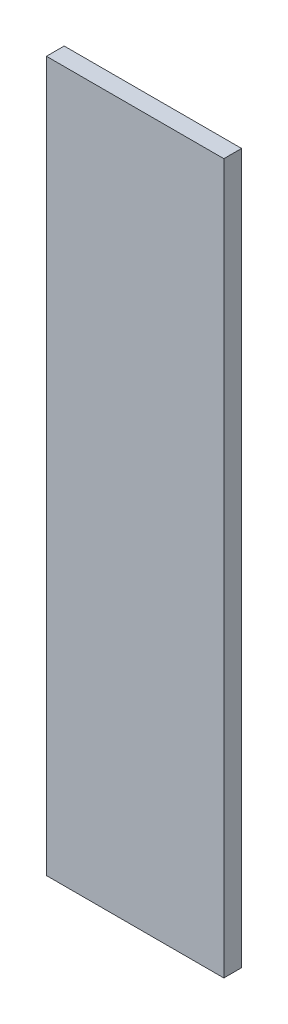
ISO-10303-21;
HEADER;
FILE_DESCRIPTION(('STEP AP214'),'2;1');
FILE_NAME('part.step','',(''),(''),'','','');
FILE_SCHEMA(('AUTOMOTIVE_DESIGN { 1 0 10303 214 1 1 1 1 }'));
ENDSEC;
DATA;
#1=APPLICATION_CONTEXT('core data for automotive mechanical design processes');
#2=APPLICATION_PROTOCOL_DEFINITION('international standard','automotive_design',2000,#1);
#3=PRODUCT_CONTEXT('',#1,'mechanical');
#4=PRODUCT('Part','Part','',(#3));
#5=PRODUCT_RELATED_PRODUCT_CATEGORY('part','',(#4));
#6=PRODUCT_DEFINITION_FORMATION('','',#4);
#7=PRODUCT_DEFINITION_CONTEXT('part definition',#1,'design');
#8=PRODUCT_DEFINITION('design','',#6,#7);
#9=PRODUCT_DEFINITION_SHAPE('','',#8);
#10=(LENGTH_UNIT() NAMED_UNIT(*) SI_UNIT(.MILLI.,.METRE.));
#11=(NAMED_UNIT(*) PLANE_ANGLE_UNIT() SI_UNIT($,.RADIAN.));
#12=(NAMED_UNIT(*) SI_UNIT($,.STERADIAN.) SOLID_ANGLE_UNIT());
#13=UNCERTAINTY_MEASURE_WITH_UNIT(LENGTH_MEASURE(1.E-05),#10,'distance_accuracy_value','');
#14=(GEOMETRIC_REPRESENTATION_CONTEXT(3) GLOBAL_UNCERTAINTY_ASSIGNED_CONTEXT((#13)) GLOBAL_UNIT_ASSIGNED_CONTEXT((#10,
#11,#12)) REPRESENTATION_CONTEXT('',''));
#15=CARTESIAN_POINT('',(0.,0.,0.));
#16=DIRECTION('',(0.,0.,1.));
#17=DIRECTION('',(1.,0.,0.));
#18=AXIS2_PLACEMENT_3D('',#15,#16,#17);
#19=CARTESIAN_POINT('',(0.,0.,8.));
#20=DIRECTION('',(1.,0.,0.));
#21=DIRECTION('',(0.,1.,0.));
#22=AXIS2_PLACEMENT_3D('',#19,#20,#21);
#23=PLANE('',#22);
#24=DIRECTION('',(0.,-1.,0.));
#25=VECTOR('',#24,1.);
#26=CARTESIAN_POINT('',(0.,0.,0.));
#27=LINE('',#26,#25);
#28=CARTESIAN_POINT('',(0.,320.,0.));
#29=VERTEX_POINT('',#28);
#30=CARTESIAN_POINT('',(0.,0.,0.));
#31=VERTEX_POINT('',#30);
#32=EDGE_CURVE('E93',#29,#31,#27,.T.);
#33=ORIENTED_EDGE('',*,*,#32,.T.);
#34=DIRECTION('',(0.,0.,-1.));
#35=VECTOR('',#34,1.);
#36=CARTESIAN_POINT('',(0.,0.,8.));
#37=LINE('',#36,#35);
#38=CARTESIAN_POINT('',(0.,0.,8.));
#39=VERTEX_POINT('',#38);
#40=EDGE_CURVE('E11',#39,#31,#37,.T.);
#41=ORIENTED_EDGE('',*,*,#40,.F.);
#42=DIRECTION('',(0.,-1.,0.));
#43=VECTOR('',#42,1.);
#44=CARTESIAN_POINT('',(0.,0.,8.));
#45=LINE('',#44,#43);
#46=CARTESIAN_POINT('',(0.,320.,8.));
#47=VERTEX_POINT('',#46);
#48=EDGE_CURVE('E81',#47,#39,#45,.T.);
#49=ORIENTED_EDGE('',*,*,#48,.F.);
#50=DIRECTION('',(0.,0.,-1.));
#51=VECTOR('',#50,1.);
#52=CARTESIAN_POINT('',(0.,320.,8.));
#53=LINE('',#52,#51);
#54=EDGE_CURVE('E89',#47,#29,#53,.T.);
#55=ORIENTED_EDGE('',*,*,#54,.T.);
#56=EDGE_LOOP('',(#33,#41,#49,#55));
#57=FACE_BOUND('',#56,.T.);
#58=ADVANCED_FACE('F30',(#57),#23,.F.);
#59=CARTESIAN_POINT('',(0.,0.,8.));
#60=DIRECTION('',(0.,1.,0.));
#61=DIRECTION('',(-1.,0.,0.));
#62=AXIS2_PLACEMENT_3D('',#59,#60,#61);
#63=PLANE('',#62);
#64=DIRECTION('',(1.,0.,0.));
#65=VECTOR('',#64,1.);
#66=CARTESIAN_POINT('',(0.,0.,0.));
#67=LINE('',#66,#65);
#68=CARTESIAN_POINT('',(80.,0.,0.));
#69=VERTEX_POINT('',#68);
#70=EDGE_CURVE('E85',#31,#69,#67,.T.);
#71=ORIENTED_EDGE('',*,*,#70,.T.);
#72=DIRECTION('',(0.,0.,-1.));
#73=VECTOR('',#72,1.);
#74=CARTESIAN_POINT('',(80.,0.,8.));
#75=LINE('',#74,#73);
#76=CARTESIAN_POINT('',(80.,0.,8.));
#77=VERTEX_POINT('',#76);
#78=EDGE_CURVE('E38',#77,#69,#75,.T.);
#79=ORIENTED_EDGE('',*,*,#78,.F.);
#80=DIRECTION('',(1.,0.,0.));
#81=VECTOR('',#80,1.);
#82=CARTESIAN_POINT('',(0.,0.,8.));
#83=LINE('',#82,#81);
#84=EDGE_CURVE('E76',#39,#77,#83,.T.);
#85=ORIENTED_EDGE('',*,*,#84,.F.);
#86=ORIENTED_EDGE('',*,*,#40,.T.);
#87=EDGE_LOOP('',(#71,#79,#85,#86));
#88=FACE_BOUND('',#87,.T.);
#89=ADVANCED_FACE('F84',(#88),#63,.F.);
#90=CARTESIAN_POINT('',(80.,0.,8.));
#91=DIRECTION('',(-1.,0.,0.));
#92=DIRECTION('',(0.,0.,1.));
#93=AXIS2_PLACEMENT_3D('',#90,#91,#92);
#94=PLANE('',#93);
#95=DIRECTION('',(0.,1.,0.));
#96=VECTOR('',#95,1.);
#97=CARTESIAN_POINT('',(80.,0.,0.));
#98=LINE('',#97,#96);
#99=CARTESIAN_POINT('',(80.,320.,0.));
#100=VERTEX_POINT('',#99);
#101=EDGE_CURVE('E63',#69,#100,#98,.T.);
#102=ORIENTED_EDGE('',*,*,#101,.T.);
#103=DIRECTION('',(0.,0.,-1.));
#104=VECTOR('',#103,1.);
#105=CARTESIAN_POINT('',(80.,320.,8.));
#106=LINE('',#105,#104);
#107=CARTESIAN_POINT('',(80.,320.,8.));
#108=VERTEX_POINT('',#107);
#109=EDGE_CURVE('E86',#108,#100,#106,.T.);
#110=ORIENTED_EDGE('',*,*,#109,.F.);
#111=DIRECTION('',(0.,1.,0.));
#112=VECTOR('',#111,1.);
#113=CARTESIAN_POINT('',(80.,0.,8.));
#114=LINE('',#113,#112);
#115=EDGE_CURVE('E79',#77,#108,#114,.T.);
#116=ORIENTED_EDGE('',*,*,#115,.F.);
#117=ORIENTED_EDGE('',*,*,#78,.T.);
#118=EDGE_LOOP('',(#102,#110,#116,#117));
#119=FACE_BOUND('',#118,.T.);
#120=ADVANCED_FACE('F87',(#119),#94,.F.);
#121=CARTESIAN_POINT('',(0.,320.,8.));
#122=DIRECTION('',(0.,-1.,0.));
#123=DIRECTION('',(0.,0.,-1.));
#124=AXIS2_PLACEMENT_3D('',#121,#122,#123);
#125=PLANE('',#124);
#126=DIRECTION('',(-1.,0.,0.));
#127=VECTOR('',#126,1.);
#128=CARTESIAN_POINT('',(0.,320.,0.));
#129=LINE('',#128,#127);
#130=EDGE_CURVE('E69',#100,#29,#129,.T.);
#131=ORIENTED_EDGE('',*,*,#130,.T.);
#132=ORIENTED_EDGE('',*,*,#54,.F.);
#133=DIRECTION('',(-1.,0.,0.));
#134=VECTOR('',#133,1.);
#135=CARTESIAN_POINT('',(0.,320.,8.));
#136=LINE('',#135,#134);
#137=EDGE_CURVE('E46',#108,#47,#136,.T.);
#138=ORIENTED_EDGE('',*,*,#137,.F.);
#139=ORIENTED_EDGE('',*,*,#109,.T.);
#140=EDGE_LOOP('',(#131,#132,#138,#139));
#141=FACE_BOUND('',#140,.T.);
#142=ADVANCED_FACE('F100',(#141),#125,.F.);
#143=CARTESIAN_POINT('',(0.,0.,8.));
#144=DIRECTION('',(0.,0.,-1.));
#145=DIRECTION('',(-1.,0.,0.));
#146=AXIS2_PLACEMENT_3D('',#143,#144,#145);
#147=PLANE('',#146);
#148=ORIENTED_EDGE('',*,*,#48,.T.);
#149=ORIENTED_EDGE('',*,*,#84,.T.);
#150=ORIENTED_EDGE('',*,*,#115,.T.);
#151=ORIENTED_EDGE('',*,*,#137,.T.);
#152=EDGE_LOOP('',(#148,#149,#150,#151));
#153=FACE_BOUND('',#152,.T.);
#154=ADVANCED_FACE('F77',(#153),#147,.F.);
#155=CARTESIAN_POINT('',(0.,0.,0.));
#156=DIRECTION('',(0.,0.,-1.));
#157=DIRECTION('',(-1.,0.,0.));
#158=AXIS2_PLACEMENT_3D('',#155,#156,#157);
#159=PLANE('',#158);
#160=ORIENTED_EDGE('',*,*,#32,.F.);
#161=ORIENTED_EDGE('',*,*,#130,.F.);
#162=ORIENTED_EDGE('',*,*,#101,.F.);
#163=ORIENTED_EDGE('',*,*,#70,.F.);
#164=EDGE_LOOP('',(#160,#161,#162,#163));
#165=FACE_BOUND('',#164,.T.);
#166=ADVANCED_FACE('F103',(#165),#159,.T.);
#167=CLOSED_SHELL('',(#58,#89,#120,#142,#154,#166));
#168=MANIFOLD_SOLID_BREP('B2',#167);
#169=ADVANCED_BREP_SHAPE_REPRESENTATION('',(#18,#168),#14);
#170=SHAPE_DEFINITION_REPRESENTATION(#9,#169);
ENDSEC;
END-ISO-10303-21;
